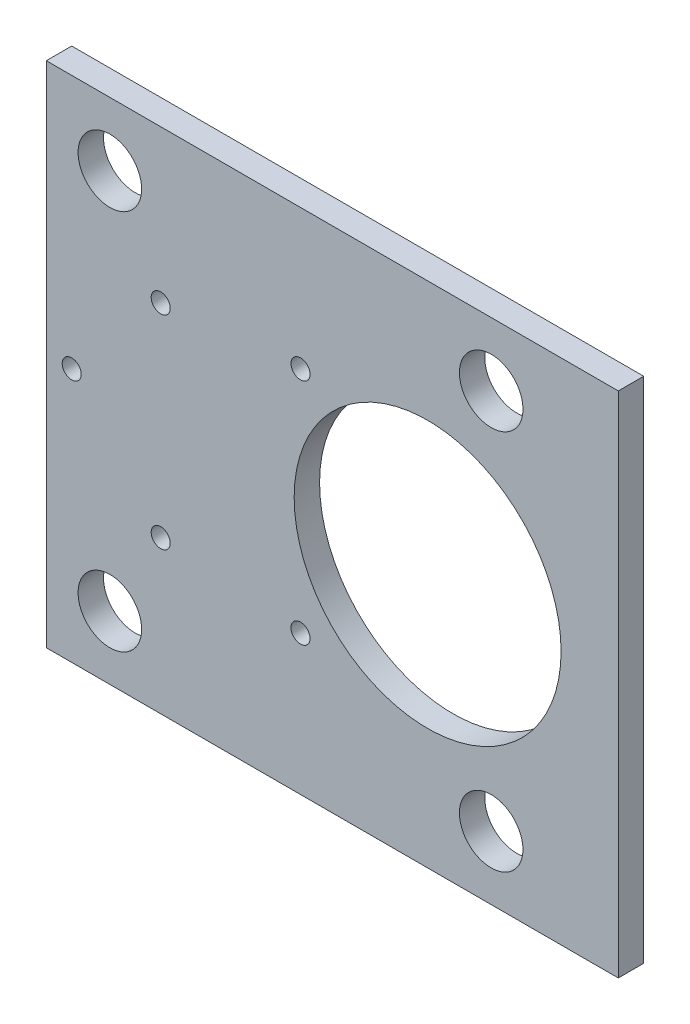
ISO-10303-21;
HEADER;
FILE_DESCRIPTION(('STEP AP214'),'2;1');
FILE_NAME('part.step','',(''),(''),'','','');
FILE_SCHEMA(('AUTOMOTIVE_DESIGN { 1 0 10303 214 1 1 1 1 }'));
ENDSEC;
DATA;
#1=APPLICATION_CONTEXT('core data for automotive mechanical design processes');
#2=APPLICATION_PROTOCOL_DEFINITION('international standard','automotive_design',2000,#1);
#3=PRODUCT_CONTEXT('',#1,'mechanical');
#4=PRODUCT('Part','Part','',(#3));
#5=PRODUCT_RELATED_PRODUCT_CATEGORY('part','',(#4));
#6=PRODUCT_DEFINITION_FORMATION('','',#4);
#7=PRODUCT_DEFINITION_CONTEXT('part definition',#1,'design');
#8=PRODUCT_DEFINITION('design','',#6,#7);
#9=PRODUCT_DEFINITION_SHAPE('','',#8);
#10=(LENGTH_UNIT() NAMED_UNIT(*) SI_UNIT(.MILLI.,.METRE.));
#11=(NAMED_UNIT(*) PLANE_ANGLE_UNIT() SI_UNIT($,.RADIAN.));
#12=(NAMED_UNIT(*) SI_UNIT($,.STERADIAN.) SOLID_ANGLE_UNIT());
#13=UNCERTAINTY_MEASURE_WITH_UNIT(LENGTH_MEASURE(1.E-05),#10,'distance_accuracy_value','');
#14=(GEOMETRIC_REPRESENTATION_CONTEXT(3) GLOBAL_UNCERTAINTY_ASSIGNED_CONTEXT((#13)) GLOBAL_UNIT_ASSIGNED_CONTEXT((#10,
#11,#12)) REPRESENTATION_CONTEXT('',''));
#15=CARTESIAN_POINT('',(0.,0.,0.));
#16=DIRECTION('',(0.,0.,1.));
#17=DIRECTION('',(1.,0.,0.));
#18=AXIS2_PLACEMENT_3D('',#15,#16,#17);
#19=CARTESIAN_POINT('',(0.,0.,2.));
#20=DIRECTION('',(0.,0.,-1.));
#21=DIRECTION('',(-1.,0.,0.));
#22=AXIS2_PLACEMENT_3D('',#19,#20,#21);
#23=PLANE('',#22);
#24=DIRECTION('',(-1.,0.,0.));
#25=VECTOR('',#24,1.);
#26=CARTESIAN_POINT('',(20.,20.,2.));
#27=LINE('',#26,#25);
#28=CARTESIAN_POINT('',(25.,20.,2.));
#29=VERTEX_POINT('',#28);
#30=CARTESIAN_POINT('',(-20.,20.,2.));
#31=VERTEX_POINT('',#30);
#32=EDGE_CURVE('E81',#29,#31,#27,.T.);
#33=ORIENTED_EDGE('',*,*,#32,.T.);
#34=DIRECTION('',(0.,-1.,0.));
#35=VECTOR('',#34,1.);
#36=CARTESIAN_POINT('',(-20.,-20.,2.));
#37=LINE('',#36,#35);
#38=CARTESIAN_POINT('',(-20.,-20.,2.));
#39=VERTEX_POINT('',#38);
#40=EDGE_CURVE('E84',#31,#39,#37,.T.);
#41=ORIENTED_EDGE('',*,*,#40,.T.);
#42=DIRECTION('',(1.,0.,0.));
#43=VECTOR('',#42,1.);
#44=CARTESIAN_POINT('',(-20.,-20.,2.));
#45=LINE('',#44,#43);
#46=CARTESIAN_POINT('',(25.,-20.,2.));
#47=VERTEX_POINT('',#46);
#48=EDGE_CURVE('E88',#39,#47,#45,.T.);
#49=ORIENTED_EDGE('',*,*,#48,.T.);
#50=DIRECTION('',(0.,1.,0.));
#51=VECTOR('',#50,1.);
#52=CARTESIAN_POINT('',(25.,20.,2.));
#53=LINE('',#52,#51);
#54=EDGE_CURVE('E53',#47,#29,#53,.T.);
#55=ORIENTED_EDGE('',*,*,#54,.T.);
#56=EDGE_LOOP('',(#33,#41,#49,#55));
#57=FACE_BOUND('',#56,.T.);
#58=CARTESIAN_POINT('',(-15.,15.,2.));
#59=DIRECTION('',(0.,0.,1.));
#60=DIRECTION('',(1.,0.,0.));
#61=AXIS2_PLACEMENT_3D('',#58,#59,#60);
#62=CIRCLE('',#61,2.5);
#63=CARTESIAN_POINT('',(-12.5,15.,2.));
#64=VERTEX_POINT('',#63);
#65=EDGE_CURVE('E102',#64,#64,#62,.T.);
#66=ORIENTED_EDGE('',*,*,#65,.F.);
#67=EDGE_LOOP('',(#66));
#68=FACE_BOUND('',#67,.T.);
#69=CARTESIAN_POINT('',(15.,15.,2.));
#70=DIRECTION('',(0.,0.,1.));
#71=DIRECTION('',(1.,0.,0.));
#72=AXIS2_PLACEMENT_3D('',#69,#70,#71);
#73=CIRCLE('',#72,2.5);
#74=CARTESIAN_POINT('',(17.5,15.,2.));
#75=VERTEX_POINT('',#74);
#76=EDGE_CURVE('E177',#75,#75,#73,.T.);
#77=ORIENTED_EDGE('',*,*,#76,.F.);
#78=EDGE_LOOP('',(#77));
#79=FACE_BOUND('',#78,.T.);
#80=CARTESIAN_POINT('',(-15.,-15.,2.));
#81=DIRECTION('',(0.,0.,1.));
#82=DIRECTION('',(1.,0.,0.));
#83=AXIS2_PLACEMENT_3D('',#80,#81,#82);
#84=CIRCLE('',#83,2.5);
#85=CARTESIAN_POINT('',(-12.5,-15.,2.));
#86=VERTEX_POINT('',#85);
#87=EDGE_CURVE('E172',#86,#86,#84,.T.);
#88=ORIENTED_EDGE('',*,*,#87,.F.);
#89=EDGE_LOOP('',(#88));
#90=FACE_BOUND('',#89,.T.);
#91=CARTESIAN_POINT('',(15.,-15.,2.));
#92=DIRECTION('',(0.,0.,1.));
#93=DIRECTION('',(1.,0.,0.));
#94=AXIS2_PLACEMENT_3D('',#91,#92,#93);
#95=CIRCLE('',#94,2.5);
#96=CARTESIAN_POINT('',(17.5,-15.,2.));
#97=VERTEX_POINT('',#96);
#98=EDGE_CURVE('E167',#97,#97,#95,.T.);
#99=ORIENTED_EDGE('',*,*,#98,.F.);
#100=EDGE_LOOP('',(#99));
#101=FACE_BOUND('',#100,.T.);
#102=CARTESIAN_POINT('',(-18.,0.,2.));
#103=DIRECTION('',(0.,0.,1.));
#104=DIRECTION('',(1.,0.,0.));
#105=AXIS2_PLACEMENT_3D('',#102,#103,#104);
#106=CIRCLE('',#105,0.750000000000002);
#107=CARTESIAN_POINT('',(-17.25,0.,2.));
#108=VERTEX_POINT('',#107);
#109=EDGE_CURVE('E162',#108,#108,#106,.T.);
#110=ORIENTED_EDGE('',*,*,#109,.F.);
#111=EDGE_LOOP('',(#110));
#112=FACE_BOUND('',#111,.T.);
#113=CARTESIAN_POINT('',(-11.,8.,2.));
#114=DIRECTION('',(0.,0.,1.));
#115=DIRECTION('',(1.,0.,0.));
#116=AXIS2_PLACEMENT_3D('',#113,#114,#115);
#117=CIRCLE('',#116,0.75);
#118=CARTESIAN_POINT('',(-10.25,8.,2.));
#119=VERTEX_POINT('',#118);
#120=EDGE_CURVE('E157',#119,#119,#117,.T.);
#121=ORIENTED_EDGE('',*,*,#120,.F.);
#122=EDGE_LOOP('',(#121));
#123=FACE_BOUND('',#122,.T.);
#124=CARTESIAN_POINT('',(0.,9.,2.));
#125=DIRECTION('',(0.,0.,1.));
#126=DIRECTION('',(1.,0.,0.));
#127=AXIS2_PLACEMENT_3D('',#124,#125,#126);
#128=CIRCLE('',#127,0.750000000000001);
#129=CARTESIAN_POINT('',(0.750000000000004,9.,2.));
#130=VERTEX_POINT('',#129);
#131=EDGE_CURVE('E152',#130,#130,#128,.T.);
#132=ORIENTED_EDGE('',*,*,#131,.F.);
#133=EDGE_LOOP('',(#132));
#134=FACE_BOUND('',#133,.T.);
#135=CARTESIAN_POINT('',(-11.,-8.,2.));
#136=DIRECTION('',(0.,0.,1.));
#137=DIRECTION('',(1.,0.,0.));
#138=AXIS2_PLACEMENT_3D('',#135,#136,#137);
#139=CIRCLE('',#138,0.75);
#140=CARTESIAN_POINT('',(-10.25,-8.,2.));
#141=VERTEX_POINT('',#140);
#142=EDGE_CURVE('E147',#141,#141,#139,.T.);
#143=ORIENTED_EDGE('',*,*,#142,.F.);
#144=EDGE_LOOP('',(#143));
#145=FACE_BOUND('',#144,.T.);
#146=CARTESIAN_POINT('',(0.,-9.,2.));
#147=DIRECTION('',(0.,0.,1.));
#148=DIRECTION('',(1.,0.,0.));
#149=AXIS2_PLACEMENT_3D('',#146,#147,#148);
#150=CIRCLE('',#149,0.75);
#151=CARTESIAN_POINT('',(0.750000000000004,-9.,2.));
#152=VERTEX_POINT('',#151);
#153=EDGE_CURVE('E142',#152,#152,#150,.T.);
#154=ORIENTED_EDGE('',*,*,#153,.F.);
#155=EDGE_LOOP('',(#154));
#156=FACE_BOUND('',#155,.T.);
#157=CARTESIAN_POINT('',(9.99999999999999,0.,2.));
#158=DIRECTION('',(0.,0.,1.));
#159=DIRECTION('',(1.,0.,0.));
#160=AXIS2_PLACEMENT_3D('',#157,#158,#159);
#161=CIRCLE('',#160,10.5);
#162=CARTESIAN_POINT('',(20.5,0.,2.));
#163=VERTEX_POINT('',#162);
#164=EDGE_CURVE('E136',#163,#163,#161,.T.);
#165=ORIENTED_EDGE('',*,*,#164,.F.);
#166=EDGE_LOOP('',(#165));
#167=FACE_BOUND('',#166,.T.);
#168=ADVANCED_FACE('F36',(#57,#68,#79,#90,#101,#112,#123,#134,#145,#156,#167),#23,.F.);
#169=CARTESIAN_POINT('',(0.,0.,0.));
#170=DIRECTION('',(0.,0.,-1.));
#171=DIRECTION('',(-1.,0.,0.));
#172=AXIS2_PLACEMENT_3D('',#169,#170,#171);
#173=PLANE('',#172);
#174=CARTESIAN_POINT('',(0.,-9.,0.));
#175=DIRECTION('',(0.,0.,1.));
#176=DIRECTION('',(1.,0.,0.));
#177=AXIS2_PLACEMENT_3D('',#174,#175,#176);
#178=CIRCLE('',#177,0.75);
#179=CARTESIAN_POINT('',(0.750000000000004,-9.,0.));
#180=VERTEX_POINT('',#179);
#181=EDGE_CURVE('E139',#180,#180,#178,.T.);
#182=ORIENTED_EDGE('',*,*,#181,.T.);
#183=EDGE_LOOP('',(#182));
#184=FACE_BOUND('',#183,.T.);
#185=CARTESIAN_POINT('',(0.,9.,0.));
#186=DIRECTION('',(0.,0.,1.));
#187=DIRECTION('',(1.,0.,0.));
#188=AXIS2_PLACEMENT_3D('',#185,#186,#187);
#189=CIRCLE('',#188,0.750000000000001);
#190=CARTESIAN_POINT('',(0.750000000000004,9.,0.));
#191=VERTEX_POINT('',#190);
#192=EDGE_CURVE('E150',#191,#191,#189,.T.);
#193=ORIENTED_EDGE('',*,*,#192,.T.);
#194=EDGE_LOOP('',(#193));
#195=FACE_BOUND('',#194,.T.);
#196=CARTESIAN_POINT('',(-18.,0.,0.));
#197=DIRECTION('',(0.,0.,1.));
#198=DIRECTION('',(1.,0.,0.));
#199=AXIS2_PLACEMENT_3D('',#196,#197,#198);
#200=CIRCLE('',#199,0.750000000000002);
#201=CARTESIAN_POINT('',(-17.25,0.,0.));
#202=VERTEX_POINT('',#201);
#203=EDGE_CURVE('E160',#202,#202,#200,.T.);
#204=ORIENTED_EDGE('',*,*,#203,.T.);
#205=EDGE_LOOP('',(#204));
#206=FACE_BOUND('',#205,.T.);
#207=CARTESIAN_POINT('',(-15.,-15.,0.));
#208=DIRECTION('',(0.,0.,1.));
#209=DIRECTION('',(1.,0.,0.));
#210=AXIS2_PLACEMENT_3D('',#207,#208,#209);
#211=CIRCLE('',#210,2.5);
#212=CARTESIAN_POINT('',(-12.5,-15.,0.));
#213=VERTEX_POINT('',#212);
#214=EDGE_CURVE('E170',#213,#213,#211,.T.);
#215=ORIENTED_EDGE('',*,*,#214,.T.);
#216=EDGE_LOOP('',(#215));
#217=FACE_BOUND('',#216,.T.);
#218=CARTESIAN_POINT('',(-15.,15.,0.));
#219=DIRECTION('',(0.,0.,1.));
#220=DIRECTION('',(1.,0.,0.));
#221=AXIS2_PLACEMENT_3D('',#218,#219,#220);
#222=CIRCLE('',#221,2.5);
#223=CARTESIAN_POINT('',(-12.5,15.,0.));
#224=VERTEX_POINT('',#223);
#225=EDGE_CURVE('E180',#224,#224,#222,.T.);
#226=ORIENTED_EDGE('',*,*,#225,.T.);
#227=EDGE_LOOP('',(#226));
#228=FACE_BOUND('',#227,.T.);
#229=DIRECTION('',(-1.,0.,0.));
#230=VECTOR('',#229,1.);
#231=CARTESIAN_POINT('',(-20.,20.,0.));
#232=LINE('',#231,#230);
#233=CARTESIAN_POINT('',(25.,20.,0.));
#234=VERTEX_POINT('',#233);
#235=CARTESIAN_POINT('',(-20.,20.,0.));
#236=VERTEX_POINT('',#235);
#237=EDGE_CURVE('E76',#234,#236,#232,.T.);
#238=ORIENTED_EDGE('',*,*,#237,.F.);
#239=DIRECTION('',(0.,1.,0.));
#240=VECTOR('',#239,1.);
#241=CARTESIAN_POINT('',(25.,20.,0.));
#242=LINE('',#241,#240);
#243=CARTESIAN_POINT('',(25.,-20.,0.));
#244=VERTEX_POINT('',#243);
#245=EDGE_CURVE('E105',#244,#234,#242,.T.);
#246=ORIENTED_EDGE('',*,*,#245,.F.);
#247=DIRECTION('',(1.,0.,0.));
#248=VECTOR('',#247,1.);
#249=CARTESIAN_POINT('',(20.,-20.,0.));
#250=LINE('',#249,#248);
#251=CARTESIAN_POINT('',(-20.,-20.,0.));
#252=VERTEX_POINT('',#251);
#253=EDGE_CURVE('E69',#252,#244,#250,.T.);
#254=ORIENTED_EDGE('',*,*,#253,.F.);
#255=DIRECTION('',(0.,-1.,0.));
#256=VECTOR('',#255,1.);
#257=CARTESIAN_POINT('',(-20.,-20.,0.));
#258=LINE('',#257,#256);
#259=EDGE_CURVE('E93',#236,#252,#258,.T.);
#260=ORIENTED_EDGE('',*,*,#259,.F.);
#261=EDGE_LOOP('',(#238,#246,#254,#260));
#262=FACE_BOUND('',#261,.T.);
#263=CARTESIAN_POINT('',(15.,15.,0.));
#264=DIRECTION('',(0.,0.,1.));
#265=DIRECTION('',(1.,0.,0.));
#266=AXIS2_PLACEMENT_3D('',#263,#264,#265);
#267=CIRCLE('',#266,2.5);
#268=CARTESIAN_POINT('',(17.5,15.,0.));
#269=VERTEX_POINT('',#268);
#270=EDGE_CURVE('E119',#269,#269,#267,.T.);
#271=ORIENTED_EDGE('',*,*,#270,.T.);
#272=EDGE_LOOP('',(#271));
#273=FACE_BOUND('',#272,.T.);
#274=CARTESIAN_POINT('',(15.,-15.,0.));
#275=DIRECTION('',(0.,0.,1.));
#276=DIRECTION('',(1.,0.,0.));
#277=AXIS2_PLACEMENT_3D('',#274,#275,#276);
#278=CIRCLE('',#277,2.5);
#279=CARTESIAN_POINT('',(17.5,-15.,0.));
#280=VERTEX_POINT('',#279);
#281=EDGE_CURVE('E123',#280,#280,#278,.T.);
#282=ORIENTED_EDGE('',*,*,#281,.T.);
#283=EDGE_LOOP('',(#282));
#284=FACE_BOUND('',#283,.T.);
#285=CARTESIAN_POINT('',(-11.,8.,0.));
#286=DIRECTION('',(0.,0.,1.));
#287=DIRECTION('',(1.,0.,0.));
#288=AXIS2_PLACEMENT_3D('',#285,#286,#287);
#289=CIRCLE('',#288,0.75);
#290=CARTESIAN_POINT('',(-10.25,8.,0.));
#291=VERTEX_POINT('',#290);
#292=EDGE_CURVE('E127',#291,#291,#289,.T.);
#293=ORIENTED_EDGE('',*,*,#292,.T.);
#294=EDGE_LOOP('',(#293));
#295=FACE_BOUND('',#294,.T.);
#296=CARTESIAN_POINT('',(-11.,-8.,0.));
#297=DIRECTION('',(0.,0.,1.));
#298=DIRECTION('',(1.,0.,0.));
#299=AXIS2_PLACEMENT_3D('',#296,#297,#298);
#300=CIRCLE('',#299,0.75);
#301=CARTESIAN_POINT('',(-10.25,-8.,0.));
#302=VERTEX_POINT('',#301);
#303=EDGE_CURVE('E131',#302,#302,#300,.T.);
#304=ORIENTED_EDGE('',*,*,#303,.T.);
#305=EDGE_LOOP('',(#304));
#306=FACE_BOUND('',#305,.T.);
#307=CARTESIAN_POINT('',(9.99999999999999,0.,0.));
#308=DIRECTION('',(0.,0.,1.));
#309=DIRECTION('',(1.,0.,0.));
#310=AXIS2_PLACEMENT_3D('',#307,#308,#309);
#311=CIRCLE('',#310,10.5);
#312=CARTESIAN_POINT('',(20.5,0.,0.));
#313=VERTEX_POINT('',#312);
#314=EDGE_CURVE('E134',#313,#313,#311,.T.);
#315=ORIENTED_EDGE('',*,*,#314,.T.);
#316=EDGE_LOOP('',(#315));
#317=FACE_BOUND('',#316,.T.);
#318=ADVANCED_FACE('F111',(#184,#195,#206,#217,#228,#262,#273,#284,#295,#306,#317),#173,.T.);
#319=CARTESIAN_POINT('',(-20.,20.,2.));
#320=DIRECTION('',(0.,-1.,0.));
#321=DIRECTION('',(0.,0.,-1.));
#322=AXIS2_PLACEMENT_3D('',#319,#320,#321);
#323=PLANE('',#322);
#324=ORIENTED_EDGE('',*,*,#237,.T.);
#325=DIRECTION('',(0.,0.,-1.));
#326=VECTOR('',#325,1.);
#327=CARTESIAN_POINT('',(-20.,20.,2.));
#328=LINE('',#327,#326);
#329=EDGE_CURVE('E11',#31,#236,#328,.T.);
#330=ORIENTED_EDGE('',*,*,#329,.F.);
#331=ORIENTED_EDGE('',*,*,#32,.F.);
#332=DIRECTION('',(0.,0.,-1.));
#333=VECTOR('',#332,1.);
#334=CARTESIAN_POINT('',(25.,20.,2.));
#335=LINE('',#334,#333);
#336=EDGE_CURVE('E97',#29,#234,#335,.T.);
#337=ORIENTED_EDGE('',*,*,#336,.T.);
#338=EDGE_LOOP('',(#324,#330,#331,#337));
#339=FACE_BOUND('',#338,.T.);
#340=ADVANCED_FACE('F38',(#339),#323,.F.);
#341=CARTESIAN_POINT('',(-20.,-20.,2.));
#342=DIRECTION('',(1.,0.,0.));
#343=DIRECTION('',(0.,0.,-1.));
#344=AXIS2_PLACEMENT_3D('',#341,#342,#343);
#345=PLANE('',#344);
#346=ORIENTED_EDGE('',*,*,#259,.T.);
#347=DIRECTION('',(0.,0.,-1.));
#348=VECTOR('',#347,1.);
#349=CARTESIAN_POINT('',(-20.,-20.,2.));
#350=LINE('',#349,#348);
#351=EDGE_CURVE('E45',#39,#252,#350,.T.);
#352=ORIENTED_EDGE('',*,*,#351,.F.);
#353=ORIENTED_EDGE('',*,*,#40,.F.);
#354=ORIENTED_EDGE('',*,*,#329,.T.);
#355=EDGE_LOOP('',(#346,#352,#353,#354));
#356=FACE_BOUND('',#355,.T.);
#357=ADVANCED_FACE('F92',(#356),#345,.F.);
#358=CARTESIAN_POINT('',(20.,-20.,2.));
#359=DIRECTION('',(0.,1.,0.));
#360=DIRECTION('',(0.,0.,1.));
#361=AXIS2_PLACEMENT_3D('',#358,#359,#360);
#362=PLANE('',#361);
#363=ORIENTED_EDGE('',*,*,#253,.T.);
#364=DIRECTION('',(0.,0.,-1.));
#365=VECTOR('',#364,1.);
#366=CARTESIAN_POINT('',(25.,-20.,2.));
#367=LINE('',#366,#365);
#368=EDGE_CURVE('E94',#47,#244,#367,.T.);
#369=ORIENTED_EDGE('',*,*,#368,.F.);
#370=ORIENTED_EDGE('',*,*,#48,.F.);
#371=ORIENTED_EDGE('',*,*,#351,.T.);
#372=EDGE_LOOP('',(#363,#369,#370,#371));
#373=FACE_BOUND('',#372,.T.);
#374=ADVANCED_FACE('F95',(#373),#362,.F.);
#375=CARTESIAN_POINT('',(25.,20.,2.));
#376=DIRECTION('',(-1.,0.,0.));
#377=DIRECTION('',(0.,-1.,0.));
#378=AXIS2_PLACEMENT_3D('',#375,#376,#377);
#379=PLANE('',#378);
#380=ORIENTED_EDGE('',*,*,#245,.T.);
#381=ORIENTED_EDGE('',*,*,#336,.F.);
#382=ORIENTED_EDGE('',*,*,#54,.F.);
#383=ORIENTED_EDGE('',*,*,#368,.T.);
#384=EDGE_LOOP('',(#380,#381,#382,#383));
#385=FACE_BOUND('',#384,.T.);
#386=ADVANCED_FACE('F110',(#385),#379,.F.);
#387=CARTESIAN_POINT('',(-15.,15.,2.));
#388=DIRECTION('',(0.,0.,-1.));
#389=DIRECTION('',(-1.,0.,0.));
#390=AXIS2_PLACEMENT_3D('',#387,#388,#389);
#391=CYLINDRICAL_SURFACE('',#390,2.5);
#392=ORIENTED_EDGE('',*,*,#65,.T.);
#393=EDGE_LOOP('',(#392));
#394=FACE_BOUND('',#393,.T.);
#395=ORIENTED_EDGE('',*,*,#225,.F.);
#396=EDGE_LOOP('',(#395));
#397=FACE_BOUND('',#396,.T.);
#398=ADVANCED_FACE('F188',(#394,#397),#391,.F.);
#399=CARTESIAN_POINT('',(15.,15.,2.));
#400=DIRECTION('',(0.,0.,-1.));
#401=DIRECTION('',(-1.,0.,0.));
#402=AXIS2_PLACEMENT_3D('',#399,#400,#401);
#403=CYLINDRICAL_SURFACE('',#402,2.5);
#404=ORIENTED_EDGE('',*,*,#76,.T.);
#405=EDGE_LOOP('',(#404));
#406=FACE_BOUND('',#405,.T.);
#407=ORIENTED_EDGE('',*,*,#270,.F.);
#408=EDGE_LOOP('',(#407));
#409=FACE_BOUND('',#408,.T.);
#410=ADVANCED_FACE('F190',(#406,#409),#403,.F.);
#411=CARTESIAN_POINT('',(-15.,-15.,2.));
#412=DIRECTION('',(0.,0.,-1.));
#413=DIRECTION('',(-1.,0.,0.));
#414=AXIS2_PLACEMENT_3D('',#411,#412,#413);
#415=CYLINDRICAL_SURFACE('',#414,2.5);
#416=ORIENTED_EDGE('',*,*,#87,.T.);
#417=EDGE_LOOP('',(#416));
#418=FACE_BOUND('',#417,.T.);
#419=ORIENTED_EDGE('',*,*,#214,.F.);
#420=EDGE_LOOP('',(#419));
#421=FACE_BOUND('',#420,.T.);
#422=ADVANCED_FACE('F197',(#418,#421),#415,.F.);
#423=CARTESIAN_POINT('',(15.,-15.,2.));
#424=DIRECTION('',(0.,0.,-1.));
#425=DIRECTION('',(-1.,0.,0.));
#426=AXIS2_PLACEMENT_3D('',#423,#424,#425);
#427=CYLINDRICAL_SURFACE('',#426,2.5);
#428=ORIENTED_EDGE('',*,*,#98,.T.);
#429=EDGE_LOOP('',(#428));
#430=FACE_BOUND('',#429,.T.);
#431=ORIENTED_EDGE('',*,*,#281,.F.);
#432=EDGE_LOOP('',(#431));
#433=FACE_BOUND('',#432,.T.);
#434=ADVANCED_FACE('F263',(#430,#433),#427,.F.);
#435=CARTESIAN_POINT('',(-18.,0.,2.));
#436=DIRECTION('',(0.,0.,-1.));
#437=DIRECTION('',(-1.,0.,0.));
#438=AXIS2_PLACEMENT_3D('',#435,#436,#437);
#439=CYLINDRICAL_SURFACE('',#438,0.750000000000002);
#440=ORIENTED_EDGE('',*,*,#109,.T.);
#441=EDGE_LOOP('',(#440));
#442=FACE_BOUND('',#441,.T.);
#443=ORIENTED_EDGE('',*,*,#203,.F.);
#444=EDGE_LOOP('',(#443));
#445=FACE_BOUND('',#444,.T.);
#446=ADVANCED_FACE('F272',(#442,#445),#439,.F.);
#447=CARTESIAN_POINT('',(-11.,8.,2.));
#448=DIRECTION('',(0.,0.,-1.));
#449=DIRECTION('',(-1.,0.,0.));
#450=AXIS2_PLACEMENT_3D('',#447,#448,#449);
#451=CYLINDRICAL_SURFACE('',#450,0.75);
#452=ORIENTED_EDGE('',*,*,#120,.T.);
#453=EDGE_LOOP('',(#452));
#454=FACE_BOUND('',#453,.T.);
#455=ORIENTED_EDGE('',*,*,#292,.F.);
#456=EDGE_LOOP('',(#455));
#457=FACE_BOUND('',#456,.T.);
#458=ADVANCED_FACE('F281',(#454,#457),#451,.F.);
#459=CARTESIAN_POINT('',(0.,9.,2.));
#460=DIRECTION('',(0.,0.,-1.));
#461=DIRECTION('',(-1.,0.,0.));
#462=AXIS2_PLACEMENT_3D('',#459,#460,#461);
#463=CYLINDRICAL_SURFACE('',#462,0.750000000000001);
#464=ORIENTED_EDGE('',*,*,#131,.T.);
#465=EDGE_LOOP('',(#464));
#466=FACE_BOUND('',#465,.T.);
#467=ORIENTED_EDGE('',*,*,#192,.F.);
#468=EDGE_LOOP('',(#467));
#469=FACE_BOUND('',#468,.T.);
#470=ADVANCED_FACE('F290',(#466,#469),#463,.F.);
#471=CARTESIAN_POINT('',(-11.,-8.,2.));
#472=DIRECTION('',(0.,0.,-1.));
#473=DIRECTION('',(-1.,0.,0.));
#474=AXIS2_PLACEMENT_3D('',#471,#472,#473);
#475=CYLINDRICAL_SURFACE('',#474,0.75);
#476=ORIENTED_EDGE('',*,*,#142,.T.);
#477=EDGE_LOOP('',(#476));
#478=FACE_BOUND('',#477,.T.);
#479=ORIENTED_EDGE('',*,*,#303,.F.);
#480=EDGE_LOOP('',(#479));
#481=FACE_BOUND('',#480,.T.);
#482=ADVANCED_FACE('F299',(#478,#481),#475,.F.);
#483=CARTESIAN_POINT('',(0.,-9.,2.));
#484=DIRECTION('',(0.,0.,-1.));
#485=DIRECTION('',(-1.,0.,0.));
#486=AXIS2_PLACEMENT_3D('',#483,#484,#485);
#487=CYLINDRICAL_SURFACE('',#486,0.75);
#488=ORIENTED_EDGE('',*,*,#153,.T.);
#489=EDGE_LOOP('',(#488));
#490=FACE_BOUND('',#489,.T.);
#491=ORIENTED_EDGE('',*,*,#181,.F.);
#492=EDGE_LOOP('',(#491));
#493=FACE_BOUND('',#492,.T.);
#494=ADVANCED_FACE('F308',(#490,#493),#487,.F.);
#495=CARTESIAN_POINT('',(9.99999999999999,0.,2.));
#496=DIRECTION('',(0.,0.,-1.));
#497=DIRECTION('',(-1.,0.,0.));
#498=AXIS2_PLACEMENT_3D('',#495,#496,#497);
#499=CYLINDRICAL_SURFACE('',#498,10.5);
#500=ORIENTED_EDGE('',*,*,#164,.T.);
#501=EDGE_LOOP('',(#500));
#502=FACE_BOUND('',#501,.T.);
#503=ORIENTED_EDGE('',*,*,#314,.F.);
#504=EDGE_LOOP('',(#503));
#505=FACE_BOUND('',#504,.T.);
#506=ADVANCED_FACE('F317',(#502,#505),#499,.F.);
#507=CLOSED_SHELL('',(#168,#318,#340,#357,#374,#386,#398,#410,#422,#434,#446,#458,#470,#482,
#494,#506));
#508=MANIFOLD_SOLID_BREP('B2',#507);
#509=ADVANCED_BREP_SHAPE_REPRESENTATION('',(#18,#508),#14);
#510=SHAPE_DEFINITION_REPRESENTATION(#9,#509);
ENDSEC;
END-ISO-10303-21;
